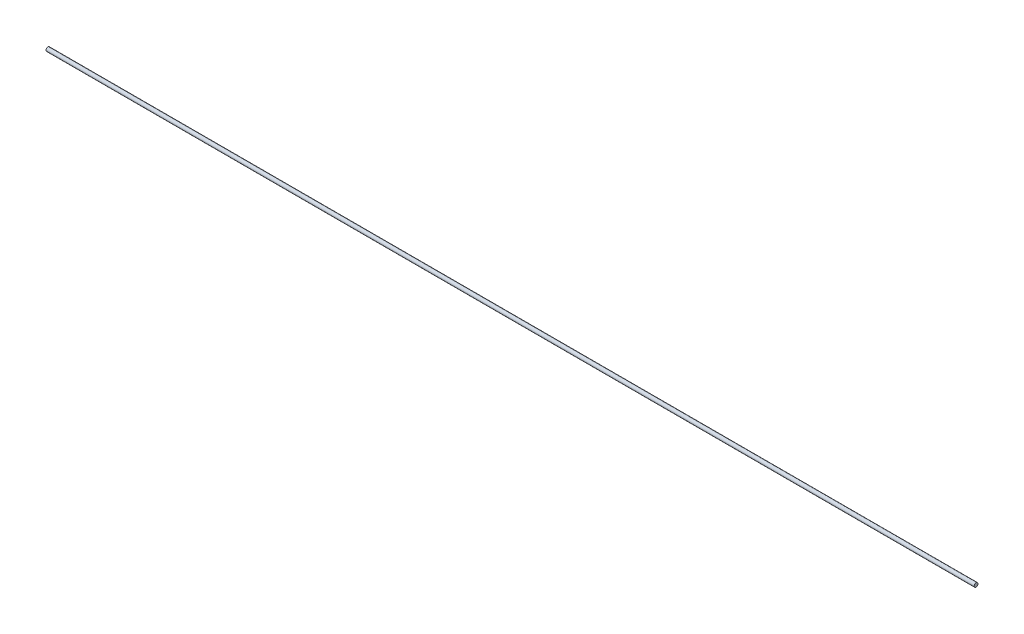
ISO-10303-21;
HEADER;
FILE_DESCRIPTION(('STEP AP214'),'2;1');
FILE_NAME('part.step','',(''),(''),'','','');
FILE_SCHEMA(('AUTOMOTIVE_DESIGN { 1 0 10303 214 1 1 1 1 }'));
ENDSEC;
DATA;
#1=APPLICATION_CONTEXT('core data for automotive mechanical design processes');
#2=APPLICATION_PROTOCOL_DEFINITION('international standard','automotive_design',2000,#1);
#3=PRODUCT_CONTEXT('',#1,'mechanical');
#4=PRODUCT('Part','Part','',(#3));
#5=PRODUCT_RELATED_PRODUCT_CATEGORY('part','',(#4));
#6=PRODUCT_DEFINITION_FORMATION('','',#4);
#7=PRODUCT_DEFINITION_CONTEXT('part definition',#1,'design');
#8=PRODUCT_DEFINITION('design','',#6,#7);
#9=PRODUCT_DEFINITION_SHAPE('','',#8);
#10=(LENGTH_UNIT() NAMED_UNIT(*) SI_UNIT(.MILLI.,.METRE.));
#11=(NAMED_UNIT(*) PLANE_ANGLE_UNIT() SI_UNIT($,.RADIAN.));
#12=(NAMED_UNIT(*) SI_UNIT($,.STERADIAN.) SOLID_ANGLE_UNIT());
#13=UNCERTAINTY_MEASURE_WITH_UNIT(LENGTH_MEASURE(1.E-05),#10,'distance_accuracy_value','');
#14=(GEOMETRIC_REPRESENTATION_CONTEXT(3) GLOBAL_UNCERTAINTY_ASSIGNED_CONTEXT((#13)) GLOBAL_UNIT_ASSIGNED_CONTEXT((#10,
#11,#12)) REPRESENTATION_CONTEXT('',''));
#15=CARTESIAN_POINT('',(0.,0.,0.));
#16=DIRECTION('',(0.,0.,1.));
#17=DIRECTION('',(1.,0.,0.));
#18=AXIS2_PLACEMENT_3D('',#15,#16,#17);
#19=CARTESIAN_POINT('',(200.,0.,0.));
#20=DIRECTION('',(-1.,0.,0.));
#21=DIRECTION('',(0.,0.,1.));
#22=AXIS2_PLACEMENT_3D('',#19,#20,#21);
#23=CYLINDRICAL_SURFACE('',#22,0.415);
#24=CARTESIAN_POINT('',(200.,0.,0.));
#25=DIRECTION('',(1.,0.,0.));
#26=DIRECTION('',(0.,0.,-1.));
#27=AXIS2_PLACEMENT_3D('',#24,#25,#26);
#28=CIRCLE('',#27,0.415);
#29=CARTESIAN_POINT('',(200.,0.,-0.415));
#30=VERTEX_POINT('',#29);
#31=EDGE_CURVE('E10',#30,#30,#28,.T.);
#32=ORIENTED_EDGE('',*,*,#31,.F.);
#33=EDGE_LOOP('',(#32));
#34=FACE_BOUND('',#33,.T.);
#35=CARTESIAN_POINT('',(0.,0.,0.));
#36=DIRECTION('',(1.,0.,0.));
#37=DIRECTION('',(0.,0.,-1.));
#38=AXIS2_PLACEMENT_3D('',#35,#36,#37);
#39=CIRCLE('',#38,0.415);
#40=CARTESIAN_POINT('',(0.,0.,-0.415));
#41=VERTEX_POINT('',#40);
#42=EDGE_CURVE('E32',#41,#41,#39,.T.);
#43=ORIENTED_EDGE('',*,*,#42,.T.);
#44=EDGE_LOOP('',(#43));
#45=FACE_BOUND('',#44,.T.);
#46=ADVANCED_FACE('F29',(#34,#45),#23,.T.);
#47=CARTESIAN_POINT('',(200.,0.,0.));
#48=DIRECTION('',(1.,0.,0.));
#49=DIRECTION('',(0.,0.,-1.));
#50=AXIS2_PLACEMENT_3D('',#47,#48,#49);
#51=PLANE('',#50);
#52=ORIENTED_EDGE('',*,*,#31,.T.);
#53=EDGE_LOOP('',(#52));
#54=FACE_BOUND('',#53,.T.);
#55=ADVANCED_FACE('F44',(#54),#51,.T.);
#56=CARTESIAN_POINT('',(0.,0.,0.));
#57=DIRECTION('',(1.,0.,0.));
#58=DIRECTION('',(0.,0.,-1.));
#59=AXIS2_PLACEMENT_3D('',#56,#57,#58);
#60=PLANE('',#59);
#61=ORIENTED_EDGE('',*,*,#42,.F.);
#62=EDGE_LOOP('',(#61));
#63=FACE_BOUND('',#62,.T.);
#64=ADVANCED_FACE('F42',(#63),#60,.F.);
#65=CLOSED_SHELL('',(#46,#55,#64));
#66=MANIFOLD_SOLID_BREP('B2',#65);
#67=ADVANCED_BREP_SHAPE_REPRESENTATION('',(#18,#66),#14);
#68=SHAPE_DEFINITION_REPRESENTATION(#9,#67);
ENDSEC;
END-ISO-10303-21;
